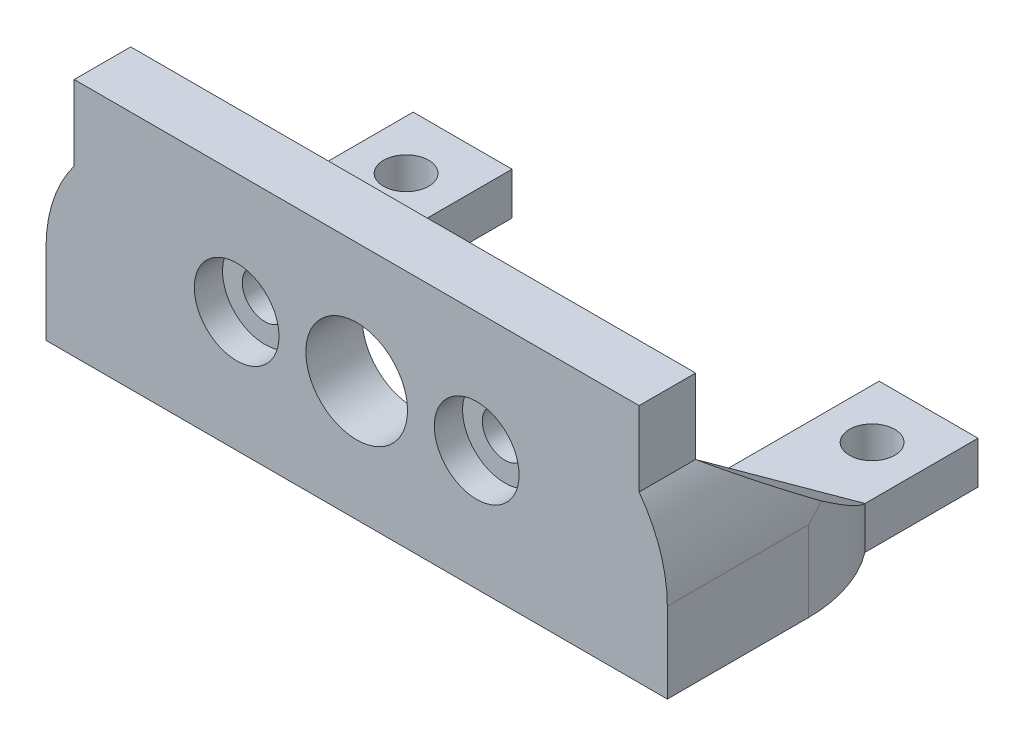
ISO-10303-21;
HEADER;
FILE_DESCRIPTION(('STEP AP214'),'2;1');
FILE_NAME('part.step','',(''),(''),'','','');
FILE_SCHEMA(('AUTOMOTIVE_DESIGN { 1 0 10303 214 1 1 1 1 }'));
ENDSEC;
DATA;
#1=APPLICATION_CONTEXT('core data for automotive mechanical design processes');
#2=APPLICATION_PROTOCOL_DEFINITION('international standard','automotive_design',2000,#1);
#3=PRODUCT_CONTEXT('',#1,'mechanical');
#4=PRODUCT('Part','Part','',(#3));
#5=PRODUCT_RELATED_PRODUCT_CATEGORY('part','',(#4));
#6=PRODUCT_DEFINITION_FORMATION('','',#4);
#7=PRODUCT_DEFINITION_CONTEXT('part definition',#1,'design');
#8=PRODUCT_DEFINITION('design','',#6,#7);
#9=PRODUCT_DEFINITION_SHAPE('','',#8);
#10=(LENGTH_UNIT() NAMED_UNIT(*) SI_UNIT(.MILLI.,.METRE.));
#11=(NAMED_UNIT(*) PLANE_ANGLE_UNIT() SI_UNIT($,.RADIAN.));
#12=(NAMED_UNIT(*) SI_UNIT($,.STERADIAN.) SOLID_ANGLE_UNIT());
#13=UNCERTAINTY_MEASURE_WITH_UNIT(LENGTH_MEASURE(1.E-05),#10,'distance_accuracy_value','');
#14=(GEOMETRIC_REPRESENTATION_CONTEXT(3) GLOBAL_UNCERTAINTY_ASSIGNED_CONTEXT((#13)) GLOBAL_UNIT_ASSIGNED_CONTEXT((#10,
#11,#12)) REPRESENTATION_CONTEXT('',''));
#15=CARTESIAN_POINT('',(0.,0.,0.));
#16=DIRECTION('',(0.,0.,1.));
#17=DIRECTION('',(1.,0.,0.));
#18=AXIS2_PLACEMENT_3D('',#15,#16,#17);
#19=CARTESIAN_POINT('',(8.5,0.,4.));
#20=DIRECTION('',(0.,0.,-1.));
#21=DIRECTION('',(-1.,0.,0.));
#22=AXIS2_PLACEMENT_3D('',#19,#20,#21);
#23=CYLINDRICAL_SURFACE('',#22,1.6);
#24=CARTESIAN_POINT('',(8.5,0.,0.));
#25=DIRECTION('',(0.,0.,1.));
#26=DIRECTION('',(1.,0.,0.));
#27=AXIS2_PLACEMENT_3D('',#24,#25,#26);
#28=CIRCLE('',#27,1.6);
#29=CARTESIAN_POINT('',(10.1,0.,0.));
#30=VERTEX_POINT('',#29);
#31=EDGE_CURVE('E298',#30,#30,#28,.T.);
#32=ORIENTED_EDGE('',*,*,#31,.F.);
#33=EDGE_LOOP('',(#32));
#34=FACE_BOUND('',#33,.T.);
#35=CARTESIAN_POINT('',(8.5,0.,2.));
#36=DIRECTION('',(0.,0.,1.));
#37=DIRECTION('',(1.,0.,0.));
#38=AXIS2_PLACEMENT_3D('',#35,#36,#37);
#39=CIRCLE('',#38,1.6);
#40=CARTESIAN_POINT('',(10.1,0.,2.));
#41=VERTEX_POINT('',#40);
#42=EDGE_CURVE('E45',#41,#41,#39,.T.);
#43=ORIENTED_EDGE('',*,*,#42,.T.);
#44=EDGE_LOOP('',(#43));
#45=FACE_BOUND('',#44,.T.);
#46=ADVANCED_FACE('F41',(#34,#45),#23,.F.);
#47=CARTESIAN_POINT('',(-8.5,0.,4.));
#48=DIRECTION('',(0.,0.,-1.));
#49=DIRECTION('',(-1.,0.,0.));
#50=AXIS2_PLACEMENT_3D('',#47,#48,#49);
#51=CYLINDRICAL_SURFACE('',#50,1.6);
#52=CARTESIAN_POINT('',(-8.5,0.,0.));
#53=DIRECTION('',(0.,0.,1.));
#54=DIRECTION('',(-1.,0.,0.));
#55=AXIS2_PLACEMENT_3D('',#52,#53,#54);
#56=CIRCLE('',#55,1.6);
#57=CARTESIAN_POINT('',(-10.1,0.,0.));
#58=VERTEX_POINT('',#57);
#59=EDGE_CURVE('E295',#58,#58,#56,.T.);
#60=ORIENTED_EDGE('',*,*,#59,.F.);
#61=EDGE_LOOP('',(#60));
#62=FACE_BOUND('',#61,.T.);
#63=CARTESIAN_POINT('',(-8.5,0.,2.));
#64=DIRECTION('',(0.,0.,1.));
#65=DIRECTION('',(1.,0.,0.));
#66=AXIS2_PLACEMENT_3D('',#63,#64,#65);
#67=CIRCLE('',#66,1.6);
#68=CARTESIAN_POINT('',(-6.9,0.,2.));
#69=VERTEX_POINT('',#68);
#70=EDGE_CURVE('E355',#69,#69,#67,.T.);
#71=ORIENTED_EDGE('',*,*,#70,.T.);
#72=EDGE_LOOP('',(#71));
#73=FACE_BOUND('',#72,.T.);
#74=ADVANCED_FACE('F392',(#62,#73),#51,.F.);
#75=CARTESIAN_POINT('',(20.,-8.5,4.));
#76=DIRECTION('',(-1.,0.,0.));
#77=DIRECTION('',(0.,0.,1.));
#78=AXIS2_PLACEMENT_3D('',#75,#76,#77);
#79=PLANE('',#78);
#80=DIRECTION('',(0.,1.,0.));
#81=VECTOR('',#80,1.);
#82=CARTESIAN_POINT('',(20.,-8.5,4.));
#83=LINE('',#82,#81);
#84=CARTESIAN_POINT('',(20.,3.19845737974604,4.));
#85=VERTEX_POINT('',#84);
#86=CARTESIAN_POINT('',(20.,8.5,4.));
#87=VERTEX_POINT('',#86);
#88=EDGE_CURVE('E308',#85,#87,#83,.T.);
#89=ORIENTED_EDGE('',*,*,#88,.F.);
#90=DIRECTION('',(0.,0.,-1.));
#91=VECTOR('',#90,1.);
#92=CARTESIAN_POINT('',(20.,3.19845737974604,4.));
#93=LINE('',#92,#91);
#94=CARTESIAN_POINT('',(20.,3.19845737974604,0.));
#95=VERTEX_POINT('',#94);
#96=EDGE_CURVE('E201',#85,#95,#93,.T.);
#97=ORIENTED_EDGE('',*,*,#96,.T.);
#98=DIRECTION('',(0.,1.,0.));
#99=VECTOR('',#98,1.);
#100=CARTESIAN_POINT('',(20.,-8.5,0.));
#101=LINE('',#100,#99);
#102=CARTESIAN_POINT('',(20.,8.5,0.));
#103=VERTEX_POINT('',#102);
#104=EDGE_CURVE('E305',#95,#103,#101,.T.);
#105=ORIENTED_EDGE('',*,*,#104,.T.);
#106=DIRECTION('',(0.,0.,-1.));
#107=VECTOR('',#106,1.);
#108=CARTESIAN_POINT('',(20.,8.5,4.));
#109=LINE('',#108,#107);
#110=EDGE_CURVE('E331',#87,#103,#109,.T.);
#111=ORIENTED_EDGE('',*,*,#110,.F.);
#112=EDGE_LOOP('',(#89,#97,#105,#111));
#113=FACE_BOUND('',#112,.T.);
#114=ADVANCED_FACE('F399',(#113),#79,.F.);
#115=CARTESIAN_POINT('',(-20.,-8.5,4.));
#116=DIRECTION('',(1.,0.,0.));
#117=DIRECTION('',(0.,0.,-1.));
#118=AXIS2_PLACEMENT_3D('',#115,#116,#117);
#119=PLANE('',#118);
#120=DIRECTION('',(0.,0.,-1.));
#121=VECTOR('',#120,1.);
#122=CARTESIAN_POINT('',(-20.,3.19845737974604,4.));
#123=LINE('',#122,#121);
#124=CARTESIAN_POINT('',(-20.,3.19845737974604,4.));
#125=VERTEX_POINT('',#124);
#126=CARTESIAN_POINT('',(-20.,3.19845737974604,0.));
#127=VERTEX_POINT('',#126);
#128=EDGE_CURVE('E250',#125,#127,#123,.T.);
#129=ORIENTED_EDGE('',*,*,#128,.F.);
#130=DIRECTION('',(0.,-1.,0.));
#131=VECTOR('',#130,1.);
#132=CARTESIAN_POINT('',(-20.,-8.5,4.));
#133=LINE('',#132,#131);
#134=CARTESIAN_POINT('',(-20.,8.5,4.));
#135=VERTEX_POINT('',#134);
#136=EDGE_CURVE('E188',#135,#125,#133,.T.);
#137=ORIENTED_EDGE('',*,*,#136,.F.);
#138=DIRECTION('',(0.,0.,-1.));
#139=VECTOR('',#138,1.);
#140=CARTESIAN_POINT('',(-20.,8.5,4.));
#141=LINE('',#140,#139);
#142=CARTESIAN_POINT('',(-20.,8.5,0.));
#143=VERTEX_POINT('',#142);
#144=EDGE_CURVE('E328',#135,#143,#141,.T.);
#145=ORIENTED_EDGE('',*,*,#144,.T.);
#146=DIRECTION('',(0.,-1.,0.));
#147=VECTOR('',#146,1.);
#148=CARTESIAN_POINT('',(-20.,-8.5,0.));
#149=LINE('',#148,#147);
#150=EDGE_CURVE('E320',#143,#127,#149,.T.);
#151=ORIENTED_EDGE('',*,*,#150,.T.);
#152=EDGE_LOOP('',(#129,#137,#145,#151));
#153=FACE_BOUND('',#152,.T.);
#154=ADVANCED_FACE('F424',(#153),#119,.F.);
#155=DIRECTION('',(0.,-1.,0.));
#156=VECTOR('',#155,1.);
#157=CARTESIAN_POINT('',(-20.,-5.5,-11.9986102014909));
#158=LINE('',#157,#156);
#159=CARTESIAN_POINT('',(-20.,-5.5,-11.9986102014909));
#160=VERTEX_POINT('',#159);
#161=CARTESIAN_POINT('',(-20.,-8.5,-11.9986102014909));
#162=VERTEX_POINT('',#161);
#163=EDGE_CURVE('E247',#160,#162,#158,.T.);
#164=ORIENTED_EDGE('',*,*,#163,.F.);
#165=DIRECTION('',(0.,0.,1.));
#166=VECTOR('',#165,1.);
#167=CARTESIAN_POINT('',(-20.,-5.5,-20.));
#168=LINE('',#167,#166);
#169=CARTESIAN_POINT('',(-20.,-5.5,-20.));
#170=VERTEX_POINT('',#169);
#171=EDGE_CURVE('E292',#170,#160,#168,.T.);
#172=ORIENTED_EDGE('',*,*,#171,.F.);
#173=DIRECTION('',(0.,1.,0.));
#174=VECTOR('',#173,1.);
#175=CARTESIAN_POINT('',(-20.,-5.5,-20.));
#176=LINE('',#175,#174);
#177=CARTESIAN_POINT('',(-20.,-8.5,-20.));
#178=VERTEX_POINT('',#177);
#179=EDGE_CURVE('E270',#178,#170,#176,.T.);
#180=ORIENTED_EDGE('',*,*,#179,.F.);
#181=DIRECTION('',(0.,0.,-1.));
#182=VECTOR('',#181,1.);
#183=CARTESIAN_POINT('',(-20.,-8.5,4.));
#184=LINE('',#183,#182);
#185=EDGE_CURVE('E326',#162,#178,#184,.T.);
#186=ORIENTED_EDGE('',*,*,#185,.F.);
#187=EDGE_LOOP('',(#164,#172,#180,#186));
#188=FACE_BOUND('',#187,.T.);
#189=ADVANCED_FACE('F414',(#188),#119,.F.);
#190=CARTESIAN_POINT('',(0.,0.,4.));
#191=DIRECTION('',(0.,0.,-1.));
#192=DIRECTION('',(-1.,0.,0.));
#193=AXIS2_PLACEMENT_3D('',#190,#191,#192);
#194=PLANE('',#193);
#195=CARTESIAN_POINT('',(-8.5,0.,4.));
#196=DIRECTION('',(0.,0.,1.));
#197=DIRECTION('',(1.,0.,0.));
#198=AXIS2_PLACEMENT_3D('',#195,#196,#197);
#199=CIRCLE('',#198,3.);
#200=CARTESIAN_POINT('',(-5.5,0.,4.));
#201=VERTEX_POINT('',#200);
#202=EDGE_CURVE('E362',#201,#201,#199,.T.);
#203=ORIENTED_EDGE('',*,*,#202,.F.);
#204=EDGE_LOOP('',(#203));
#205=FACE_BOUND('',#204,.T.);
#206=CARTESIAN_POINT('',(8.5,0.,4.));
#207=DIRECTION('',(0.,0.,1.));
#208=DIRECTION('',(1.,0.,0.));
#209=AXIS2_PLACEMENT_3D('',#206,#207,#208);
#210=CIRCLE('',#209,3.);
#211=CARTESIAN_POINT('',(11.5,0.,4.));
#212=VERTEX_POINT('',#211);
#213=EDGE_CURVE('E367',#212,#212,#210,.T.);
#214=ORIENTED_EDGE('',*,*,#213,.F.);
#215=EDGE_LOOP('',(#214));
#216=FACE_BOUND('',#215,.T.);
#217=DIRECTION('',(0.,1.,0.));
#218=VECTOR('',#217,1.);
#219=CARTESIAN_POINT('',(22.,-8.5,4.));
#220=LINE('',#219,#218);
#221=CARTESIAN_POINT('',(22.,-8.5,4.));
#222=VERTEX_POINT('',#221);
#223=CARTESIAN_POINT('',(22.,-2.80154262025395,4.));
#224=VERTEX_POINT('',#223);
#225=EDGE_CURVE('E178',#222,#224,#220,.T.);
#226=ORIENTED_EDGE('',*,*,#225,.T.);
#227=CARTESIAN_POINT('',(12.,-2.80154262025395,4.));
#228=DIRECTION('',(0.,0.,-1.));
#229=DIRECTION('',(-1.,0.,0.));
#230=AXIS2_PLACEMENT_3D('',#227,#228,#229);
#231=CIRCLE('',#230,10.);
#232=EDGE_CURVE('E11',#224,#85,#231,.F.);
#233=ORIENTED_EDGE('',*,*,#232,.T.);
#234=ORIENTED_EDGE('',*,*,#88,.T.);
#235=DIRECTION('',(-1.,0.,0.));
#236=VECTOR('',#235,1.);
#237=CARTESIAN_POINT('',(-20.,8.5,4.));
#238=LINE('',#237,#236);
#239=EDGE_CURVE('E310',#87,#135,#238,.T.);
#240=ORIENTED_EDGE('',*,*,#239,.T.);
#241=ORIENTED_EDGE('',*,*,#136,.T.);
#242=CARTESIAN_POINT('',(-12.,-2.80154262025396,4.));
#243=DIRECTION('',(0.,0.,-1.));
#244=DIRECTION('',(-1.,0.,0.));
#245=AXIS2_PLACEMENT_3D('',#242,#243,#244);
#246=CIRCLE('',#245,10.);
#247=CARTESIAN_POINT('',(-22.,-2.80154262025396,4.));
#248=VERTEX_POINT('',#247);
#249=EDGE_CURVE('E345',#125,#248,#246,.F.);
#250=ORIENTED_EDGE('',*,*,#249,.T.);
#251=DIRECTION('',(0.,1.,0.));
#252=VECTOR('',#251,1.);
#253=CARTESIAN_POINT('',(-22.,-8.5,4.));
#254=LINE('',#253,#252);
#255=CARTESIAN_POINT('',(-22.,-8.5,4.));
#256=VERTEX_POINT('',#255);
#257=EDGE_CURVE('E186',#256,#248,#254,.T.);
#258=ORIENTED_EDGE('',*,*,#257,.F.);
#259=DIRECTION('',(1.,0.,0.));
#260=VECTOR('',#259,1.);
#261=CARTESIAN_POINT('',(-20.,-8.5,4.));
#262=LINE('',#261,#260);
#263=EDGE_CURVE('E173',#256,#222,#262,.T.);
#264=ORIENTED_EDGE('',*,*,#263,.T.);
#265=EDGE_LOOP('',(#226,#233,#234,#240,#241,#250,#258,#264));
#266=FACE_BOUND('',#265,.T.);
#267=CARTESIAN_POINT('',(0.,0.,4.));
#268=DIRECTION('',(0.,0.,1.));
#269=DIRECTION('',(1.,0.,0.));
#270=AXIS2_PLACEMENT_3D('',#267,#268,#269);
#271=CIRCLE('',#270,3.6);
#272=CARTESIAN_POINT('',(3.6,0.,4.));
#273=VERTEX_POINT('',#272);
#274=EDGE_CURVE('E302',#273,#273,#271,.T.);
#275=ORIENTED_EDGE('',*,*,#274,.F.);
#276=EDGE_LOOP('',(#275));
#277=FACE_BOUND('',#276,.T.);
#278=ADVANCED_FACE('F182',(#205,#216,#266,#277),#194,.F.);
#279=CARTESIAN_POINT('',(0.,0.,0.));
#280=DIRECTION('',(0.,0.,-1.));
#281=DIRECTION('',(-1.,0.,0.));
#282=AXIS2_PLACEMENT_3D('',#279,#280,#281);
#283=PLANE('',#282);
#284=DIRECTION('',(0.,-1.,0.));
#285=VECTOR('',#284,1.);
#286=CARTESIAN_POINT('',(13.,-5.5,0.));
#287=LINE('',#286,#285);
#288=CARTESIAN_POINT('',(13.,-5.5,0.));
#289=VERTEX_POINT('',#288);
#290=CARTESIAN_POINT('',(13.,-8.5,0.));
#291=VERTEX_POINT('',#290);
#292=EDGE_CURVE('E218',#289,#291,#287,.T.);
#293=ORIENTED_EDGE('',*,*,#292,.T.);
#294=DIRECTION('',(1.,0.,0.));
#295=VECTOR('',#294,1.);
#296=CARTESIAN_POINT('',(-20.,-8.5,0.));
#297=LINE('',#296,#295);
#298=CARTESIAN_POINT('',(-13.,-8.5,0.));
#299=VERTEX_POINT('',#298);
#300=EDGE_CURVE('E311',#299,#291,#297,.T.);
#301=ORIENTED_EDGE('',*,*,#300,.F.);
#302=DIRECTION('',(0.,-1.,0.));
#303=VECTOR('',#302,1.);
#304=CARTESIAN_POINT('',(-13.,-5.5,0.));
#305=LINE('',#304,#303);
#306=CARTESIAN_POINT('',(-13.,-5.5,0.));
#307=VERTEX_POINT('',#306);
#308=EDGE_CURVE('E274',#307,#299,#305,.T.);
#309=ORIENTED_EDGE('',*,*,#308,.F.);
#310=DIRECTION('',(1.,0.,0.));
#311=VECTOR('',#310,1.);
#312=CARTESIAN_POINT('',(-20.,-5.5,0.));
#313=LINE('',#312,#311);
#314=CARTESIAN_POINT('',(-20.,-5.5,0.));
#315=VERTEX_POINT('',#314);
#316=EDGE_CURVE('E269',#315,#307,#313,.T.);
#317=ORIENTED_EDGE('',*,*,#316,.F.);
#318=EDGE_CURVE('E319',#127,#315,#149,.T.);
#319=ORIENTED_EDGE('',*,*,#318,.F.);
#320=ORIENTED_EDGE('',*,*,#150,.F.);
#321=DIRECTION('',(-1.,0.,0.));
#322=VECTOR('',#321,1.);
#323=CARTESIAN_POINT('',(-20.,8.5,0.));
#324=LINE('',#323,#322);
#325=EDGE_CURVE('E317',#103,#143,#324,.T.);
#326=ORIENTED_EDGE('',*,*,#325,.F.);
#327=ORIENTED_EDGE('',*,*,#104,.F.);
#328=CARTESIAN_POINT('',(20.,-5.5,0.));
#329=VERTEX_POINT('',#328);
#330=EDGE_CURVE('E315',#329,#95,#101,.T.);
#331=ORIENTED_EDGE('',*,*,#330,.F.);
#332=DIRECTION('',(-1.,0.,0.));
#333=VECTOR('',#332,1.);
#334=CARTESIAN_POINT('',(20.,-5.5,0.));
#335=LINE('',#334,#333);
#336=EDGE_CURVE('E223',#329,#289,#335,.T.);
#337=ORIENTED_EDGE('',*,*,#336,.T.);
#338=EDGE_LOOP('',(#293,#301,#309,#317,#319,#320,#326,#327,#331,#337));
#339=FACE_BOUND('',#338,.T.);
#340=ORIENTED_EDGE('',*,*,#31,.T.);
#341=EDGE_LOOP('',(#340));
#342=FACE_BOUND('',#341,.T.);
#343=CARTESIAN_POINT('',(0.,0.,0.));
#344=DIRECTION('',(0.,0.,1.));
#345=DIRECTION('',(1.,0.,0.));
#346=AXIS2_PLACEMENT_3D('',#343,#344,#345);
#347=CIRCLE('',#346,3.6);
#348=CARTESIAN_POINT('',(3.6,0.,0.));
#349=VERTEX_POINT('',#348);
#350=EDGE_CURVE('E301',#349,#349,#347,.T.);
#351=ORIENTED_EDGE('',*,*,#350,.T.);
#352=EDGE_LOOP('',(#351));
#353=FACE_BOUND('',#352,.T.);
#354=ORIENTED_EDGE('',*,*,#59,.T.);
#355=EDGE_LOOP('',(#354));
#356=FACE_BOUND('',#355,.T.);
#357=ADVANCED_FACE('F413',(#339,#342,#353,#356),#283,.T.);
#358=DIRECTION('',(0.,0.,1.));
#359=VECTOR('',#358,1.);
#360=CARTESIAN_POINT('',(20.,-5.5,-20.));
#361=LINE('',#360,#359);
#362=CARTESIAN_POINT('',(20.,-5.5,-20.));
#363=VERTEX_POINT('',#362);
#364=CARTESIAN_POINT('',(20.,-5.5,-11.9986102014909));
#365=VERTEX_POINT('',#364);
#366=EDGE_CURVE('E237',#363,#365,#361,.T.);
#367=ORIENTED_EDGE('',*,*,#366,.T.);
#368=DIRECTION('',(0.,-1.,0.));
#369=VECTOR('',#368,1.);
#370=CARTESIAN_POINT('',(20.,-5.5,-11.9986102014909));
#371=LINE('',#370,#369);
#372=CARTESIAN_POINT('',(20.,-8.5,-11.9986102014909));
#373=VERTEX_POINT('',#372);
#374=EDGE_CURVE('E195',#365,#373,#371,.T.);
#375=ORIENTED_EDGE('',*,*,#374,.T.);
#376=DIRECTION('',(0.,0.,-1.));
#377=VECTOR('',#376,1.);
#378=CARTESIAN_POINT('',(20.,-8.5,4.));
#379=LINE('',#378,#377);
#380=CARTESIAN_POINT('',(20.,-8.5,-20.));
#381=VERTEX_POINT('',#380);
#382=EDGE_CURVE('E187',#373,#381,#379,.T.);
#383=ORIENTED_EDGE('',*,*,#382,.T.);
#384=DIRECTION('',(0.,1.,0.));
#385=VECTOR('',#384,1.);
#386=CARTESIAN_POINT('',(20.,-5.5,-20.));
#387=LINE('',#386,#385);
#388=EDGE_CURVE('E219',#381,#363,#387,.T.);
#389=ORIENTED_EDGE('',*,*,#388,.T.);
#390=EDGE_LOOP('',(#367,#375,#383,#389));
#391=FACE_BOUND('',#390,.T.);
#392=ADVANCED_FACE('F418',(#391),#79,.F.);
#393=CARTESIAN_POINT('',(-20.,8.5,4.));
#394=DIRECTION('',(0.,-1.,0.));
#395=DIRECTION('',(0.,0.,-1.));
#396=AXIS2_PLACEMENT_3D('',#393,#394,#395);
#397=PLANE('',#396);
#398=ORIENTED_EDGE('',*,*,#325,.T.);
#399=ORIENTED_EDGE('',*,*,#144,.F.);
#400=ORIENTED_EDGE('',*,*,#239,.F.);
#401=ORIENTED_EDGE('',*,*,#110,.T.);
#402=EDGE_LOOP('',(#398,#399,#400,#401));
#403=FACE_BOUND('',#402,.T.);
#404=ADVANCED_FACE('F422',(#403),#397,.F.);
#405=CARTESIAN_POINT('',(-20.,-8.5,4.));
#406=DIRECTION('',(0.,1.,0.));
#407=DIRECTION('',(0.,0.,1.));
#408=AXIS2_PLACEMENT_3D('',#405,#406,#407);
#409=PLANE('',#408);
#410=CARTESIAN_POINT('',(16.5,-8.5,-4.));
#411=DIRECTION('',(0.,1.,0.));
#412=DIRECTION('',(0.,0.,1.));
#413=AXIS2_PLACEMENT_3D('',#410,#411,#412);
#414=CIRCLE('',#413,1.59766491124832);
#415=CARTESIAN_POINT('',(16.5,-8.5,-2.40233508875168));
#416=VERTEX_POINT('',#415);
#417=EDGE_CURVE('E215',#416,#416,#414,.F.);
#418=ORIENTED_EDGE('',*,*,#417,.F.);
#419=EDGE_LOOP('',(#418));
#420=FACE_BOUND('',#419,.T.);
#421=CARTESIAN_POINT('',(16.5,-8.5,-16.));
#422=DIRECTION('',(0.,1.,0.));
#423=DIRECTION('',(0.,0.,1.));
#424=AXIS2_PLACEMENT_3D('',#421,#422,#423);
#425=CIRCLE('',#424,1.6);
#426=CARTESIAN_POINT('',(16.5,-8.5,-14.4));
#427=VERTEX_POINT('',#426);
#428=EDGE_CURVE('E210',#427,#427,#425,.F.);
#429=ORIENTED_EDGE('',*,*,#428,.F.);
#430=EDGE_LOOP('',(#429));
#431=FACE_BOUND('',#430,.T.);
#432=CARTESIAN_POINT('',(-16.5,-8.5,-4.));
#433=DIRECTION('',(0.,1.,0.));
#434=DIRECTION('',(0.,0.,1.));
#435=AXIS2_PLACEMENT_3D('',#432,#433,#434);
#436=CIRCLE('',#435,1.59766491124832);
#437=CARTESIAN_POINT('',(-16.5,-8.5,-2.40233508875168));
#438=VERTEX_POINT('',#437);
#439=EDGE_CURVE('E266',#438,#438,#436,.T.);
#440=ORIENTED_EDGE('',*,*,#439,.T.);
#441=EDGE_LOOP('',(#440));
#442=FACE_BOUND('',#441,.T.);
#443=CARTESIAN_POINT('',(-16.5,-8.5,-16.));
#444=DIRECTION('',(0.,1.,0.));
#445=DIRECTION('',(0.,0.,1.));
#446=AXIS2_PLACEMENT_3D('',#443,#444,#445);
#447=CIRCLE('',#446,1.6);
#448=CARTESIAN_POINT('',(-16.5,-8.5,-14.4));
#449=VERTEX_POINT('',#448);
#450=EDGE_CURVE('E261',#449,#449,#447,.T.);
#451=ORIENTED_EDGE('',*,*,#450,.T.);
#452=EDGE_LOOP('',(#451));
#453=FACE_BOUND('',#452,.T.);
#454=ORIENTED_EDGE('',*,*,#382,.F.);
#455=CARTESIAN_POINT('',(12.,-8.5,-5.9986102014909));
#456=DIRECTION('',(0.,1.,0.));
#457=DIRECTION('',(0.,0.,1.));
#458=AXIS2_PLACEMENT_3D('',#455,#456,#457);
#459=CIRCLE('',#458,10.);
#460=CARTESIAN_POINT('',(22.,-8.5,-5.9986102014909));
#461=VERTEX_POINT('',#460);
#462=EDGE_CURVE('E175',#373,#461,#459,.F.);
#463=ORIENTED_EDGE('',*,*,#462,.T.);
#464=DIRECTION('',(0.,0.,1.));
#465=VECTOR('',#464,1.);
#466=CARTESIAN_POINT('',(22.,-8.5,-11.9986102014909));
#467=LINE('',#466,#465);
#468=EDGE_CURVE('E168',#461,#222,#467,.T.);
#469=ORIENTED_EDGE('',*,*,#468,.T.);
#470=ORIENTED_EDGE('',*,*,#263,.F.);
#471=DIRECTION('',(0.,0.,1.));
#472=VECTOR('',#471,1.);
#473=CARTESIAN_POINT('',(-22.,-8.5,-11.9986102014909));
#474=LINE('',#473,#472);
#475=CARTESIAN_POINT('',(-22.,-8.5,-5.99861020149089));
#476=VERTEX_POINT('',#475);
#477=EDGE_CURVE('E245',#476,#256,#474,.T.);
#478=ORIENTED_EDGE('',*,*,#477,.F.);
#479=CARTESIAN_POINT('',(-12.,-8.5,-5.99861020149089));
#480=DIRECTION('',(0.,1.,0.));
#481=DIRECTION('',(0.,0.,1.));
#482=AXIS2_PLACEMENT_3D('',#479,#480,#481);
#483=CIRCLE('',#482,10.);
#484=EDGE_CURVE('E339',#476,#162,#483,.F.);
#485=ORIENTED_EDGE('',*,*,#484,.T.);
#486=ORIENTED_EDGE('',*,*,#185,.T.);
#487=DIRECTION('',(-1.,0.,0.));
#488=VECTOR('',#487,1.);
#489=CARTESIAN_POINT('',(-20.,-8.5,-20.));
#490=LINE('',#489,#488);
#491=CARTESIAN_POINT('',(-13.,-8.5,-20.));
#492=VERTEX_POINT('',#491);
#493=EDGE_CURVE('E278',#492,#178,#490,.T.);
#494=ORIENTED_EDGE('',*,*,#493,.F.);
#495=DIRECTION('',(0.,0.,1.));
#496=VECTOR('',#495,1.);
#497=CARTESIAN_POINT('',(-13.,-8.5,-20.));
#498=LINE('',#497,#496);
#499=EDGE_CURVE('E281',#492,#299,#498,.T.);
#500=ORIENTED_EDGE('',*,*,#499,.T.);
#501=ORIENTED_EDGE('',*,*,#300,.T.);
#502=DIRECTION('',(0.,0.,1.));
#503=VECTOR('',#502,1.);
#504=CARTESIAN_POINT('',(13.,-8.5,-20.));
#505=LINE('',#504,#503);
#506=CARTESIAN_POINT('',(13.,-8.5,-20.));
#507=VERTEX_POINT('',#506);
#508=EDGE_CURVE('E242',#507,#291,#505,.T.);
#509=ORIENTED_EDGE('',*,*,#508,.F.);
#510=DIRECTION('',(1.,0.,0.));
#511=VECTOR('',#510,1.);
#512=CARTESIAN_POINT('',(20.,-8.5,-20.));
#513=LINE('',#512,#511);
#514=EDGE_CURVE('E222',#507,#381,#513,.T.);
#515=ORIENTED_EDGE('',*,*,#514,.T.);
#516=EDGE_LOOP('',(#454,#463,#469,#470,#478,#485,#486,#494,#500,#501,#509,#515));
#517=FACE_BOUND('',#516,.T.);
#518=ADVANCED_FACE('F171',(#420,#431,#442,#453,#517),#409,.F.);
#519=CARTESIAN_POINT('',(0.,0.,4.));
#520=DIRECTION('',(0.,0.,-1.));
#521=DIRECTION('',(-1.,0.,0.));
#522=AXIS2_PLACEMENT_3D('',#519,#520,#521);
#523=CYLINDRICAL_SURFACE('',#522,3.6);
#524=ORIENTED_EDGE('',*,*,#274,.T.);
#525=EDGE_LOOP('',(#524));
#526=FACE_BOUND('',#525,.T.);
#527=ORIENTED_EDGE('',*,*,#350,.F.);
#528=EDGE_LOOP('',(#527));
#529=FACE_BOUND('',#528,.T.);
#530=ADVANCED_FACE('F406',(#526,#529),#523,.F.);
#531=CARTESIAN_POINT('',(-20.,-5.5,-20.));
#532=DIRECTION('',(0.,-1.,0.));
#533=DIRECTION('',(1.,0.,0.));
#534=AXIS2_PLACEMENT_3D('',#531,#532,#533);
#535=PLANE('',#534);
#536=CARTESIAN_POINT('',(-16.5,-5.5,-4.));
#537=DIRECTION('',(0.,1.,0.));
#538=DIRECTION('',(-1.,0.,0.));
#539=AXIS2_PLACEMENT_3D('',#536,#537,#538);
#540=CIRCLE('',#539,1.59766491124832);
#541=CARTESIAN_POINT('',(-18.0976649112483,-5.5,-4.));
#542=VERTEX_POINT('',#541);
#543=EDGE_CURVE('E258',#542,#542,#540,.T.);
#544=ORIENTED_EDGE('',*,*,#543,.F.);
#545=EDGE_LOOP('',(#544));
#546=FACE_BOUND('',#545,.T.);
#547=CARTESIAN_POINT('',(-16.5,-5.5,-16.));
#548=DIRECTION('',(0.,1.,0.));
#549=DIRECTION('',(-1.,0.,0.));
#550=AXIS2_PLACEMENT_3D('',#547,#548,#549);
#551=CIRCLE('',#550,1.6);
#552=CARTESIAN_POINT('',(-18.1,-5.5,-16.));
#553=VERTEX_POINT('',#552);
#554=EDGE_CURVE('E249',#553,#553,#551,.T.);
#555=ORIENTED_EDGE('',*,*,#554,.F.);
#556=EDGE_LOOP('',(#555));
#557=FACE_BOUND('',#556,.T.);
#558=ORIENTED_EDGE('',*,*,#316,.T.);
#559=DIRECTION('',(0.,0.,1.));
#560=VECTOR('',#559,1.);
#561=CARTESIAN_POINT('',(-13.,-5.5,-20.));
#562=LINE('',#561,#560);
#563=CARTESIAN_POINT('',(-13.,-5.5,-20.));
#564=VERTEX_POINT('',#563);
#565=EDGE_CURVE('E288',#564,#307,#562,.T.);
#566=ORIENTED_EDGE('',*,*,#565,.F.);
#567=DIRECTION('',(1.,0.,0.));
#568=VECTOR('',#567,1.);
#569=CARTESIAN_POINT('',(-20.,-5.5,-20.));
#570=LINE('',#569,#568);
#571=EDGE_CURVE('E273',#170,#564,#570,.T.);
#572=ORIENTED_EDGE('',*,*,#571,.F.);
#573=ORIENTED_EDGE('',*,*,#171,.T.);
#574=EDGE_CURVE('E291',#160,#315,#168,.T.);
#575=ORIENTED_EDGE('',*,*,#574,.T.);
#576=EDGE_LOOP('',(#558,#566,#572,#573,#575));
#577=FACE_BOUND('',#576,.T.);
#578=ADVANCED_FACE('F409',(#546,#557,#577),#535,.F.);
#579=CARTESIAN_POINT('',(-13.,-5.5,-20.));
#580=DIRECTION('',(-1.,0.,0.));
#581=DIRECTION('',(0.,0.,1.));
#582=AXIS2_PLACEMENT_3D('',#579,#580,#581);
#583=PLANE('',#582);
#584=ORIENTED_EDGE('',*,*,#308,.T.);
#585=ORIENTED_EDGE('',*,*,#499,.F.);
#586=DIRECTION('',(0.,-1.,0.));
#587=VECTOR('',#586,1.);
#588=CARTESIAN_POINT('',(-13.,-5.5,-20.));
#589=LINE('',#588,#587);
#590=EDGE_CURVE('E276',#564,#492,#589,.T.);
#591=ORIENTED_EDGE('',*,*,#590,.F.);
#592=ORIENTED_EDGE('',*,*,#565,.T.);
#593=EDGE_LOOP('',(#584,#585,#591,#592));
#594=FACE_BOUND('',#593,.T.);
#595=ADVANCED_FACE('F490',(#594),#583,.F.);
#596=CARTESIAN_POINT('',(0.,0.,-20.));
#597=DIRECTION('',(0.,0.,1.));
#598=DIRECTION('',(1.,0.,0.));
#599=AXIS2_PLACEMENT_3D('',#596,#597,#598);
#600=PLANE('',#599);
#601=ORIENTED_EDGE('',*,*,#179,.T.);
#602=ORIENTED_EDGE('',*,*,#571,.T.);
#603=ORIENTED_EDGE('',*,*,#590,.T.);
#604=ORIENTED_EDGE('',*,*,#493,.T.);
#605=EDGE_LOOP('',(#601,#602,#603,#604));
#606=FACE_BOUND('',#605,.T.);
#607=ADVANCED_FACE('F493',(#606),#600,.F.);
#608=CARTESIAN_POINT('',(-16.5,-25.5,-16.));
#609=DIRECTION('',(0.,1.,0.));
#610=DIRECTION('',(-1.,0.,0.));
#611=AXIS2_PLACEMENT_3D('',#608,#609,#610);
#612=CYLINDRICAL_SURFACE('',#611,1.6);
#613=ORIENTED_EDGE('',*,*,#554,.T.);
#614=EDGE_LOOP('',(#613));
#615=FACE_BOUND('',#614,.T.);
#616=ORIENTED_EDGE('',*,*,#450,.F.);
#617=EDGE_LOOP('',(#616));
#618=FACE_BOUND('',#617,.T.);
#619=ADVANCED_FACE('F495',(#615,#618),#612,.F.);
#620=CARTESIAN_POINT('',(-16.5,-25.5,-4.));
#621=DIRECTION('',(0.,1.,0.));
#622=DIRECTION('',(-1.,0.,0.));
#623=AXIS2_PLACEMENT_3D('',#620,#621,#622);
#624=CYLINDRICAL_SURFACE('',#623,1.59766491124832);
#625=ORIENTED_EDGE('',*,*,#543,.T.);
#626=EDGE_LOOP('',(#625));
#627=FACE_BOUND('',#626,.T.);
#628=ORIENTED_EDGE('',*,*,#439,.F.);
#629=EDGE_LOOP('',(#628));
#630=FACE_BOUND('',#629,.T.);
#631=ADVANCED_FACE('F501',(#627,#630),#624,.F.);
#632=CARTESIAN_POINT('',(-20.,0.,0.));
#633=DIRECTION('',(-1.,0.,0.));
#634=DIRECTION('',(0.,0.,1.));
#635=AXIS2_PLACEMENT_3D('',#632,#633,#634);
#636=PLANE('',#635);
#637=DIRECTION('',(0.,-0.58694390800312,-0.80962759887372));
#638=VECTOR('',#637,1.);
#639=CARTESIAN_POINT('',(-20.,3.19845737974604,0.));
#640=LINE('',#639,#638);
#641=EDGE_CURVE('E253',#127,#160,#640,.T.);
#642=ORIENTED_EDGE('',*,*,#641,.F.);
#643=ORIENTED_EDGE('',*,*,#318,.T.);
#644=ORIENTED_EDGE('',*,*,#574,.F.);
#645=EDGE_LOOP('',(#642,#643,#644));
#646=FACE_BOUND('',#645,.T.);
#647=ADVANCED_FACE('F482',(#646),#636,.F.);
#648=CARTESIAN_POINT('',(-22.,3.19845737974604,0.));
#649=DIRECTION('',(0.,-0.80962759887372,0.58694390800312));
#650=DIRECTION('',(0.,-0.58694390800312,-0.80962759887372));
#651=AXIS2_PLACEMENT_3D('',#648,#649,#650);
#652=PLANE('',#651);
#653=ORIENTED_EDGE('',*,*,#641,.T.);
#654=CARTESIAN_POINT('',(-12.,-1.15026753915289,-5.99861020149089));
#655=DIRECTION('',(0.,-0.80962759887372,0.58694390800312));
#656=DIRECTION('',(0.,0.58694390800312,0.80962759887372));
#657=AXIS2_PLACEMENT_3D('',#654,#655,#656);
#658=ELLIPSE('',#657,12.3513576042999,10.);
#659=CARTESIAN_POINT('',(-21.954074751679,-1.84425695861131,-6.95589586313354));
#660=VERTEX_POINT('',#659);
#661=EDGE_CURVE('E343',#160,#660,#658,.F.);
#662=ORIENTED_EDGE('',*,*,#661,.T.);
#663=CARTESIAN_POINT('',(-12.,-2.80154262025397,-8.27637109271521));
#664=DIRECTION('',(0.,-0.80962759887372,0.58694390800312));
#665=DIRECTION('',(0.,0.58694390800312,0.80962759887372));
#666=AXIS2_PLACEMENT_3D('',#663,#664,#665);
#667=ELLIPSE('',#666,17.0374031720027,10.);
#668=EDGE_CURVE('E341',#660,#127,#667,.F.);
#669=ORIENTED_EDGE('',*,*,#668,.T.);
#670=EDGE_LOOP('',(#653,#662,#669));
#671=FACE_BOUND('',#670,.T.);
#672=ADVANCED_FACE('F476',(#671),#652,.F.);
#673=CARTESIAN_POINT('',(-22.,0.,0.));
#674=DIRECTION('',(-1.,0.,0.));
#675=DIRECTION('',(0.,0.,1.));
#676=AXIS2_PLACEMENT_3D('',#673,#674,#675);
#677=PLANE('',#676);
#678=DIRECTION('',(0.,0.,-1.));
#679=VECTOR('',#678,1.);
#680=CARTESIAN_POINT('',(-22.,-2.80154262025396,0.));
#681=LINE('',#680,#679);
#682=CARTESIAN_POINT('',(-22.,-2.80154262025397,-5.99861020149089));
#683=VERTEX_POINT('',#682);
#684=EDGE_CURVE('E334',#248,#683,#681,.T.);
#685=ORIENTED_EDGE('',*,*,#684,.T.);
#686=DIRECTION('',(0.,-1.,0.));
#687=VECTOR('',#686,1.);
#688=CARTESIAN_POINT('',(-22.,-8.5,-5.99861020149089));
#689=LINE('',#688,#687);
#690=EDGE_CURVE('E336',#683,#476,#689,.T.);
#691=ORIENTED_EDGE('',*,*,#690,.T.);
#692=ORIENTED_EDGE('',*,*,#477,.T.);
#693=ORIENTED_EDGE('',*,*,#257,.T.);
#694=EDGE_LOOP('',(#685,#691,#692,#693));
#695=FACE_BOUND('',#694,.T.);
#696=ADVANCED_FACE('F441',(#695),#677,.T.);
#697=CARTESIAN_POINT('',(-12.,-2.80154262025396,4.));
#698=DIRECTION('',(0.,0.,1.));
#699=DIRECTION('',(0.,-1.,0.));
#700=AXIS2_PLACEMENT_3D('',#697,#698,#699);
#701=CYLINDRICAL_SURFACE('',#700,10.);
#702=ORIENTED_EDGE('',*,*,#128,.T.);
#703=ORIENTED_EDGE('',*,*,#668,.F.);
#704=CARTESIAN_POINT('',(-12.,-2.80154262025397,-5.99861020149089));
#705=DIRECTION('',(0.,0.707106781186548,0.707106781186547));
#706=DIRECTION('',(0.,0.707106781186547,-0.707106781186548));
#707=AXIS2_PLACEMENT_3D('',#704,#705,#706);
#708=ELLIPSE('',#707,14.1421356237309,10.);
#709=EDGE_CURVE('E244',#683,#660,#708,.F.);
#710=ORIENTED_EDGE('',*,*,#709,.F.);
#711=ORIENTED_EDGE('',*,*,#684,.F.);
#712=ORIENTED_EDGE('',*,*,#249,.F.);
#713=EDGE_LOOP('',(#702,#703,#710,#711,#712));
#714=FACE_BOUND('',#713,.T.);
#715=ADVANCED_FACE('F438',(#714),#701,.T.);
#716=CARTESIAN_POINT('',(-12.,-5.5,-5.99861020149089));
#717=DIRECTION('',(0.,1.,0.));
#718=DIRECTION('',(0.,0.,1.));
#719=AXIS2_PLACEMENT_3D('',#716,#717,#718);
#720=CYLINDRICAL_SURFACE('',#719,10.);
#721=ORIENTED_EDGE('',*,*,#661,.F.);
#722=ORIENTED_EDGE('',*,*,#163,.T.);
#723=ORIENTED_EDGE('',*,*,#484,.F.);
#724=ORIENTED_EDGE('',*,*,#690,.F.);
#725=ORIENTED_EDGE('',*,*,#709,.T.);
#726=EDGE_LOOP('',(#721,#722,#723,#724,#725));
#727=FACE_BOUND('',#726,.T.);
#728=ADVANCED_FACE('F434',(#727),#720,.T.);
#729=CARTESIAN_POINT('',(13.,-5.5,-20.));
#730=DIRECTION('',(-1.,0.,0.));
#731=DIRECTION('',(0.,0.,1.));
#732=AXIS2_PLACEMENT_3D('',#729,#730,#731);
#733=PLANE('',#732);
#734=ORIENTED_EDGE('',*,*,#292,.F.);
#735=DIRECTION('',(0.,0.,1.));
#736=VECTOR('',#735,1.);
#737=CARTESIAN_POINT('',(13.,-5.5,-20.));
#738=LINE('',#737,#736);
#739=CARTESIAN_POINT('',(13.,-5.5,-20.));
#740=VERTEX_POINT('',#739);
#741=EDGE_CURVE('E240',#740,#289,#738,.T.);
#742=ORIENTED_EDGE('',*,*,#741,.F.);
#743=DIRECTION('',(0.,-1.,0.));
#744=VECTOR('',#743,1.);
#745=CARTESIAN_POINT('',(13.,-5.5,-20.));
#746=LINE('',#745,#744);
#747=EDGE_CURVE('E226',#740,#507,#746,.T.);
#748=ORIENTED_EDGE('',*,*,#747,.T.);
#749=ORIENTED_EDGE('',*,*,#508,.T.);
#750=EDGE_LOOP('',(#734,#742,#748,#749));
#751=FACE_BOUND('',#750,.T.);
#752=ADVANCED_FACE('F437',(#751),#733,.T.);
#753=CARTESIAN_POINT('',(20.,-5.5,-20.));
#754=DIRECTION('',(0.,1.,0.));
#755=DIRECTION('',(-1.,0.,0.));
#756=AXIS2_PLACEMENT_3D('',#753,#754,#755);
#757=PLANE('',#756);
#758=CARTESIAN_POINT('',(16.5,-5.5,-4.));
#759=DIRECTION('',(0.,-1.,0.));
#760=DIRECTION('',(1.,0.,0.));
#761=AXIS2_PLACEMENT_3D('',#758,#759,#760);
#762=CIRCLE('',#761,1.59766491124832);
#763=CARTESIAN_POINT('',(18.0976649112483,-5.5,-4.));
#764=VERTEX_POINT('',#763);
#765=EDGE_CURVE('E207',#764,#764,#762,.T.);
#766=ORIENTED_EDGE('',*,*,#765,.T.);
#767=EDGE_LOOP('',(#766));
#768=FACE_BOUND('',#767,.T.);
#769=CARTESIAN_POINT('',(16.5,-5.5,-16.));
#770=DIRECTION('',(0.,-1.,0.));
#771=DIRECTION('',(1.,0.,0.));
#772=AXIS2_PLACEMENT_3D('',#769,#770,#771);
#773=CIRCLE('',#772,1.6);
#774=CARTESIAN_POINT('',(18.1,-5.5,-16.));
#775=VERTEX_POINT('',#774);
#776=EDGE_CURVE('E177',#775,#775,#773,.T.);
#777=ORIENTED_EDGE('',*,*,#776,.T.);
#778=EDGE_LOOP('',(#777));
#779=FACE_BOUND('',#778,.T.);
#780=ORIENTED_EDGE('',*,*,#336,.F.);
#781=EDGE_CURVE('E232',#365,#329,#361,.T.);
#782=ORIENTED_EDGE('',*,*,#781,.F.);
#783=ORIENTED_EDGE('',*,*,#366,.F.);
#784=DIRECTION('',(-1.,0.,0.));
#785=VECTOR('',#784,1.);
#786=CARTESIAN_POINT('',(20.,-5.5,-20.));
#787=LINE('',#786,#785);
#788=EDGE_CURVE('E229',#363,#740,#787,.T.);
#789=ORIENTED_EDGE('',*,*,#788,.T.);
#790=ORIENTED_EDGE('',*,*,#741,.T.);
#791=EDGE_LOOP('',(#780,#782,#783,#789,#790));
#792=FACE_BOUND('',#791,.T.);
#793=ADVANCED_FACE('F532',(#768,#779,#792),#757,.T.);
#794=CARTESIAN_POINT('',(0.,0.,-20.));
#795=DIRECTION('',(0.,0.,1.));
#796=DIRECTION('',(-1.,0.,0.));
#797=AXIS2_PLACEMENT_3D('',#794,#795,#796);
#798=PLANE('',#797);
#799=ORIENTED_EDGE('',*,*,#388,.F.);
#800=ORIENTED_EDGE('',*,*,#514,.F.);
#801=ORIENTED_EDGE('',*,*,#747,.F.);
#802=ORIENTED_EDGE('',*,*,#788,.F.);
#803=EDGE_LOOP('',(#799,#800,#801,#802));
#804=FACE_BOUND('',#803,.T.);
#805=ADVANCED_FACE('F536',(#804),#798,.F.);
#806=CARTESIAN_POINT('',(16.5,-25.5,-16.));
#807=DIRECTION('',(0.,1.,0.));
#808=DIRECTION('',(-1.,0.,0.));
#809=AXIS2_PLACEMENT_3D('',#806,#807,#808);
#810=CYLINDRICAL_SURFACE('',#809,1.6);
#811=ORIENTED_EDGE('',*,*,#776,.F.);
#812=EDGE_LOOP('',(#811));
#813=FACE_BOUND('',#812,.T.);
#814=ORIENTED_EDGE('',*,*,#428,.T.);
#815=EDGE_LOOP('',(#814));
#816=FACE_BOUND('',#815,.T.);
#817=ADVANCED_FACE('F540',(#813,#816),#810,.F.);
#818=CARTESIAN_POINT('',(16.5,-25.5,-4.));
#819=DIRECTION('',(0.,1.,0.));
#820=DIRECTION('',(-1.,0.,0.));
#821=AXIS2_PLACEMENT_3D('',#818,#819,#820);
#822=CYLINDRICAL_SURFACE('',#821,1.59766491124832);
#823=ORIENTED_EDGE('',*,*,#765,.F.);
#824=EDGE_LOOP('',(#823));
#825=FACE_BOUND('',#824,.T.);
#826=ORIENTED_EDGE('',*,*,#417,.T.);
#827=EDGE_LOOP('',(#826));
#828=FACE_BOUND('',#827,.T.);
#829=ADVANCED_FACE('F544',(#825,#828),#822,.F.);
#830=CARTESIAN_POINT('',(20.,0.,0.));
#831=DIRECTION('',(1.,0.,0.));
#832=DIRECTION('',(0.,0.,1.));
#833=AXIS2_PLACEMENT_3D('',#830,#831,#832);
#834=PLANE('',#833);
#835=DIRECTION('',(0.,-0.58694390800312,-0.80962759887372));
#836=VECTOR('',#835,1.);
#837=CARTESIAN_POINT('',(20.,3.19845737974604,0.));
#838=LINE('',#837,#836);
#839=EDGE_CURVE('E192',#95,#365,#838,.T.);
#840=ORIENTED_EDGE('',*,*,#839,.T.);
#841=ORIENTED_EDGE('',*,*,#781,.T.);
#842=ORIENTED_EDGE('',*,*,#330,.T.);
#843=EDGE_LOOP('',(#840,#841,#842));
#844=FACE_BOUND('',#843,.T.);
#845=ADVANCED_FACE('F548',(#844),#834,.F.);
#846=CARTESIAN_POINT('',(22.,3.19845737974604,0.));
#847=DIRECTION('',(0.,0.80962759887372,-0.58694390800312));
#848=DIRECTION('',(0.,0.58694390800312,0.80962759887372));
#849=AXIS2_PLACEMENT_3D('',#846,#847,#848);
#850=PLANE('',#849);
#851=CARTESIAN_POINT('',(12.,-2.80154262025396,-8.2763710927152));
#852=DIRECTION('',(0.,0.80962759887372,-0.58694390800312));
#853=DIRECTION('',(0.,0.58694390800312,0.80962759887372));
#854=AXIS2_PLACEMENT_3D('',#851,#852,#853);
#855=ELLIPSE('',#854,17.0374031720027,10.);
#856=CARTESIAN_POINT('',(21.954074751679,-1.84425695861131,-6.95589586313354));
#857=VERTEX_POINT('',#856);
#858=EDGE_CURVE('E58',#95,#857,#855,.T.);
#859=ORIENTED_EDGE('',*,*,#858,.T.);
#860=CARTESIAN_POINT('',(12.,-1.15026753915289,-5.9986102014909));
#861=DIRECTION('',(0.,0.80962759887372,-0.58694390800312));
#862=DIRECTION('',(0.,0.58694390800312,0.80962759887372));
#863=AXIS2_PLACEMENT_3D('',#860,#861,#862);
#864=ELLIPSE('',#863,12.3513576042999,10.);
#865=EDGE_CURVE('E50',#857,#365,#864,.T.);
#866=ORIENTED_EDGE('',*,*,#865,.T.);
#867=ORIENTED_EDGE('',*,*,#839,.F.);
#868=EDGE_LOOP('',(#859,#866,#867));
#869=FACE_BOUND('',#868,.T.);
#870=ADVANCED_FACE('F550',(#869),#850,.T.);
#871=CARTESIAN_POINT('',(22.,0.,0.));
#872=DIRECTION('',(1.,0.,0.));
#873=DIRECTION('',(0.,0.,1.));
#874=AXIS2_PLACEMENT_3D('',#871,#872,#873);
#875=PLANE('',#874);
#876=ORIENTED_EDGE('',*,*,#468,.F.);
#877=DIRECTION('',(0.,-1.,0.));
#878=VECTOR('',#877,1.);
#879=CARTESIAN_POINT('',(22.,-5.5,-5.9986102014909));
#880=LINE('',#879,#878);
#881=CARTESIAN_POINT('',(22.,-2.80154262025396,-5.9986102014909));
#882=VERTEX_POINT('',#881);
#883=EDGE_CURVE('E66',#461,#882,#880,.F.);
#884=ORIENTED_EDGE('',*,*,#883,.T.);
#885=DIRECTION('',(0.,0.,-1.));
#886=VECTOR('',#885,1.);
#887=CARTESIAN_POINT('',(22.,-2.80154262025395,4.));
#888=LINE('',#887,#886);
#889=EDGE_CURVE('E191',#882,#224,#888,.F.);
#890=ORIENTED_EDGE('',*,*,#889,.T.);
#891=ORIENTED_EDGE('',*,*,#225,.F.);
#892=EDGE_LOOP('',(#876,#884,#890,#891));
#893=FACE_BOUND('',#892,.T.);
#894=ADVANCED_FACE('F190',(#893),#875,.T.);
#895=CARTESIAN_POINT('',(12.,-2.80154262025395,4.));
#896=DIRECTION('',(0.,0.,1.));
#897=DIRECTION('',(0.,-1.,0.));
#898=AXIS2_PLACEMENT_3D('',#895,#896,#897);
#899=CYLINDRICAL_SURFACE('',#898,10.);
#900=ORIENTED_EDGE('',*,*,#232,.F.);
#901=ORIENTED_EDGE('',*,*,#889,.F.);
#902=CARTESIAN_POINT('',(12.,-2.80154262025396,-5.9986102014909));
#903=DIRECTION('',(0.,0.707106781186548,0.707106781186547));
#904=DIRECTION('',(0.,-0.707106781186547,0.707106781186548));
#905=AXIS2_PLACEMENT_3D('',#902,#903,#904);
#906=ELLIPSE('',#905,14.1421356237309,10.);
#907=EDGE_CURVE('E204',#857,#882,#906,.F.);
#908=ORIENTED_EDGE('',*,*,#907,.F.);
#909=ORIENTED_EDGE('',*,*,#858,.F.);
#910=ORIENTED_EDGE('',*,*,#96,.F.);
#911=EDGE_LOOP('',(#900,#901,#908,#909,#910));
#912=FACE_BOUND('',#911,.T.);
#913=ADVANCED_FACE('F43',(#912),#899,.T.);
#914=CARTESIAN_POINT('',(12.,-5.5,-5.9986102014909));
#915=DIRECTION('',(0.,1.,0.));
#916=DIRECTION('',(0.,0.,1.));
#917=AXIS2_PLACEMENT_3D('',#914,#915,#916);
#918=CYLINDRICAL_SURFACE('',#917,10.);
#919=ORIENTED_EDGE('',*,*,#907,.T.);
#920=ORIENTED_EDGE('',*,*,#883,.F.);
#921=ORIENTED_EDGE('',*,*,#462,.F.);
#922=ORIENTED_EDGE('',*,*,#374,.F.);
#923=ORIENTED_EDGE('',*,*,#865,.F.);
#924=EDGE_LOOP('',(#919,#920,#921,#922,#923));
#925=FACE_BOUND('',#924,.T.);
#926=ADVANCED_FACE('F443',(#925),#918,.T.);
#927=CARTESIAN_POINT('',(-8.5,0.,2.));
#928=DIRECTION('',(0.,0.,1.));
#929=DIRECTION('',(1.,0.,0.));
#930=AXIS2_PLACEMENT_3D('',#927,#928,#929);
#931=CYLINDRICAL_SURFACE('',#930,3.);
#932=CARTESIAN_POINT('',(-8.5,0.,2.));
#933=DIRECTION('',(0.,0.,1.));
#934=DIRECTION('',(1.,0.,0.));
#935=AXIS2_PLACEMENT_3D('',#932,#933,#934);
#936=CIRCLE('',#935,3.);
#937=CARTESIAN_POINT('',(-5.5,0.,2.));
#938=VERTEX_POINT('',#937);
#939=EDGE_CURVE('E357',#938,#938,#936,.T.);
#940=ORIENTED_EDGE('',*,*,#939,.F.);
#941=EDGE_LOOP('',(#940));
#942=FACE_BOUND('',#941,.T.);
#943=ORIENTED_EDGE('',*,*,#202,.T.);
#944=EDGE_LOOP('',(#943));
#945=FACE_BOUND('',#944,.T.);
#946=ADVANCED_FACE('F387',(#942,#945),#931,.F.);
#947=CARTESIAN_POINT('',(-8.5,0.,2.));
#948=DIRECTION('',(0.,0.,1.));
#949=DIRECTION('',(1.,0.,0.));
#950=AXIS2_PLACEMENT_3D('',#947,#948,#949);
#951=PLANE('',#950);
#952=ORIENTED_EDGE('',*,*,#70,.F.);
#953=EDGE_LOOP('',(#952));
#954=FACE_BOUND('',#953,.T.);
#955=ORIENTED_EDGE('',*,*,#939,.T.);
#956=EDGE_LOOP('',(#955));
#957=FACE_BOUND('',#956,.T.);
#958=ADVANCED_FACE('F379',(#954,#957),#951,.T.);
#959=CARTESIAN_POINT('',(8.5,0.,2.));
#960=DIRECTION('',(0.,0.,1.));
#961=DIRECTION('',(1.,0.,0.));
#962=AXIS2_PLACEMENT_3D('',#959,#960,#961);
#963=CYLINDRICAL_SURFACE('',#962,3.);
#964=CARTESIAN_POINT('',(8.5,0.,2.));
#965=DIRECTION('',(0.,0.,1.));
#966=DIRECTION('',(1.,0.,0.));
#967=AXIS2_PLACEMENT_3D('',#964,#965,#966);
#968=CIRCLE('',#967,3.);
#969=CARTESIAN_POINT('',(11.5,0.,2.));
#970=VERTEX_POINT('',#969);
#971=EDGE_CURVE('E198',#970,#970,#968,.T.);
#972=ORIENTED_EDGE('',*,*,#971,.F.);
#973=EDGE_LOOP('',(#972));
#974=FACE_BOUND('',#973,.T.);
#975=ORIENTED_EDGE('',*,*,#213,.T.);
#976=EDGE_LOOP('',(#975));
#977=FACE_BOUND('',#976,.T.);
#978=ADVANCED_FACE('F377',(#974,#977),#963,.F.);
#979=CARTESIAN_POINT('',(8.5,0.,2.));
#980=DIRECTION('',(0.,0.,1.));
#981=DIRECTION('',(1.,0.,0.));
#982=AXIS2_PLACEMENT_3D('',#979,#980,#981);
#983=PLANE('',#982);
#984=ORIENTED_EDGE('',*,*,#42,.F.);
#985=EDGE_LOOP('',(#984));
#986=FACE_BOUND('',#985,.T.);
#987=ORIENTED_EDGE('',*,*,#971,.T.);
#988=EDGE_LOOP('',(#987));
#989=FACE_BOUND('',#988,.T.);
#990=ADVANCED_FACE('F375',(#986,#989),#983,.T.);
#991=CLOSED_SHELL('',(#46,#74,#114,#154,#189,#278,#357,#392,#404,#518,#530,#578,#595,#607,#619,
#631,#647,#672,#696,#715,#728,#752,#793,#805,#817,#829,#845,#870,#894,#913,#926,#946,#958,#978,#990));
#992=MANIFOLD_SOLID_BREP('B2',#991);
#993=ADVANCED_BREP_SHAPE_REPRESENTATION('',(#18,#992),#14);
#994=SHAPE_DEFINITION_REPRESENTATION(#9,#993);
ENDSEC;
END-ISO-10303-21;
